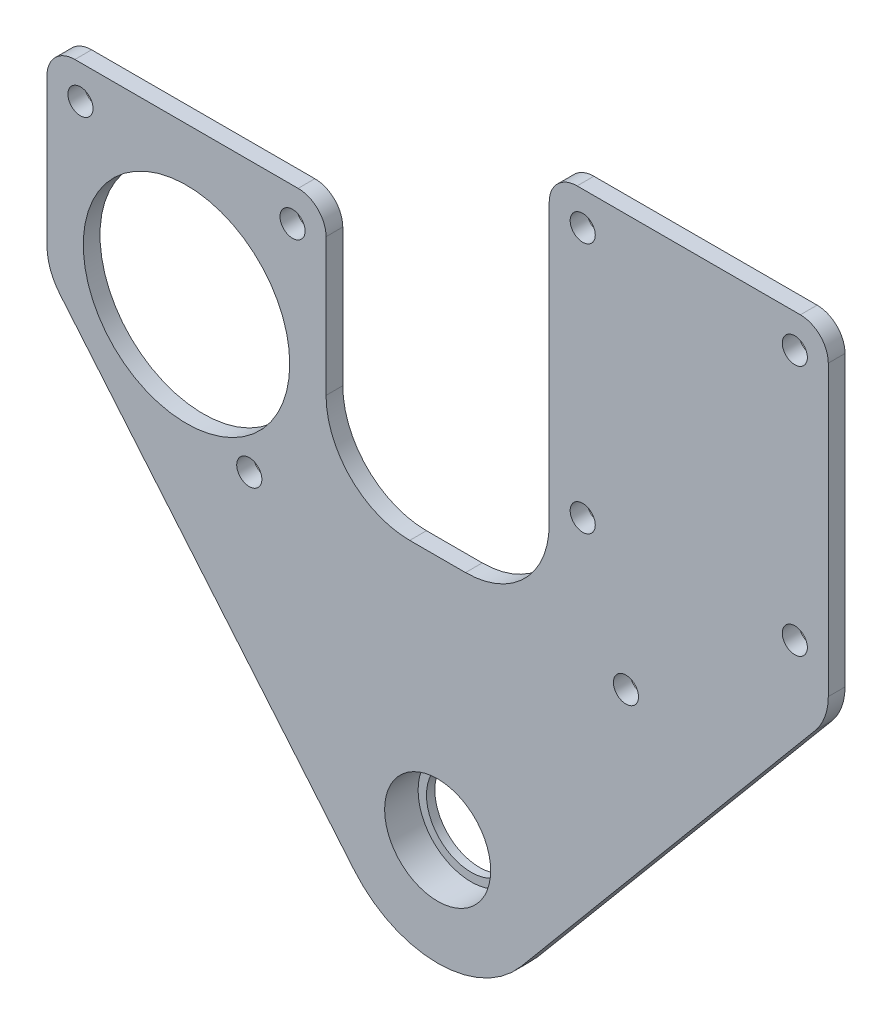
ISO-10303-21;
HEADER;
FILE_DESCRIPTION(('STEP AP214'),'2;1');
FILE_NAME('part.step','',(''),(''),'','','');
FILE_SCHEMA(('AUTOMOTIVE_DESIGN { 1 0 10303 214 1 1 1 1 }'));
ENDSEC;
DATA;
#1=APPLICATION_CONTEXT('core data for automotive mechanical design processes');
#2=APPLICATION_PROTOCOL_DEFINITION('international standard','automotive_design',2000,#1);
#3=PRODUCT_CONTEXT('',#1,'mechanical');
#4=PRODUCT('Part','Part','',(#3));
#5=PRODUCT_RELATED_PRODUCT_CATEGORY('part','',(#4));
#6=PRODUCT_DEFINITION_FORMATION('','',#4);
#7=PRODUCT_DEFINITION_CONTEXT('part definition',#1,'design');
#8=PRODUCT_DEFINITION('design','',#6,#7);
#9=PRODUCT_DEFINITION_SHAPE('','',#8);
#10=(LENGTH_UNIT() NAMED_UNIT(*) SI_UNIT(.MILLI.,.METRE.));
#11=(NAMED_UNIT(*) PLANE_ANGLE_UNIT() SI_UNIT($,.RADIAN.));
#12=(NAMED_UNIT(*) SI_UNIT($,.STERADIAN.) SOLID_ANGLE_UNIT());
#13=UNCERTAINTY_MEASURE_WITH_UNIT(LENGTH_MEASURE(1.E-05),#10,'distance_accuracy_value','');
#14=(GEOMETRIC_REPRESENTATION_CONTEXT(3) GLOBAL_UNCERTAINTY_ASSIGNED_CONTEXT((#13)) GLOBAL_UNIT_ASSIGNED_CONTEXT((#10,
#11,#12)) REPRESENTATION_CONTEXT('',''));
#15=CARTESIAN_POINT('',(0.,0.,0.));
#16=DIRECTION('',(0.,0.,1.));
#17=DIRECTION('',(1.,0.,0.));
#18=AXIS2_PLACEMENT_3D('',#15,#16,#17);
#19=CARTESIAN_POINT('',(0.,0.380634304939509,0.));
#20=DIRECTION('',(0.,0.,-1.));
#21=DIRECTION('',(-1.,0.,0.));
#22=AXIS2_PLACEMENT_3D('',#19,#20,#21);
#23=PLANE('',#22);
#24=CARTESIAN_POINT('',(0.,0.,0.));
#25=DIRECTION('',(0.,0.,-1.));
#26=DIRECTION('',(-1.,0.,0.));
#27=AXIS2_PLACEMENT_3D('',#24,#25,#26);
#28=CIRCLE('',#27,14.5);
#29=CARTESIAN_POINT('',(-14.5,0.,0.));
#30=VERTEX_POINT('',#29);
#31=EDGE_CURVE('E11',#30,#30,#28,.F.);
#32=ORIENTED_EDGE('',*,*,#31,.T.);
#33=EDGE_LOOP('',(#32));
#34=FACE_BOUND('',#33,.T.);
#35=CARTESIAN_POINT('',(63.995132678058,63.0000000000001,0.));
#36=DIRECTION('',(0.,0.,1.));
#37=DIRECTION('',(1.,0.,0.));
#38=AXIS2_PLACEMENT_3D('',#35,#36,#37);
#39=CIRCLE('',#38,2.25);
#40=CARTESIAN_POINT('',(66.245132678058,63.0000000000001,0.));
#41=VERTEX_POINT('',#40);
#42=EDGE_CURVE('E485',#41,#41,#39,.T.);
#43=ORIENTED_EDGE('',*,*,#42,.T.);
#44=EDGE_LOOP('',(#43));
#45=FACE_BOUND('',#44,.T.);
#46=CARTESIAN_POINT('',(63.995132678058,108.,0.));
#47=DIRECTION('',(0.,0.,1.));
#48=DIRECTION('',(1.,0.,0.));
#49=AXIS2_PLACEMENT_3D('',#46,#47,#48);
#50=CIRCLE('',#49,2.25000000000001);
#51=CARTESIAN_POINT('',(66.2451326780581,108.,0.));
#52=VERTEX_POINT('',#51);
#53=EDGE_CURVE('E473',#52,#52,#50,.T.);
#54=ORIENTED_EDGE('',*,*,#53,.T.);
#55=EDGE_LOOP('',(#54));
#56=FACE_BOUND('',#55,.T.);
#57=CARTESIAN_POINT('',(-25.9951326780577,82.6231110183285,0.));
#58=DIRECTION('',(0.,0.,1.));
#59=DIRECTION('',(1.,0.,0.));
#60=AXIS2_PLACEMENT_3D('',#57,#58,#59);
#61=CIRCLE('',#60,2.25);
#62=CARTESIAN_POINT('',(-23.7451326780577,82.6231110183285,0.));
#63=VERTEX_POINT('',#62);
#64=EDGE_CURVE('E461',#63,#63,#61,.T.);
#65=ORIENTED_EDGE('',*,*,#64,.T.);
#66=EDGE_LOOP('',(#65));
#67=FACE_BOUND('',#66,.T.);
#68=CARTESIAN_POINT('',(33.7463495085435,40.2173332637462,0.));
#69=DIRECTION('',(0.,0.,1.));
#70=DIRECTION('',(1.,0.,0.));
#71=AXIS2_PLACEMENT_3D('',#68,#69,#70);
#72=CIRCLE('',#71,2.25000000000002);
#73=CARTESIAN_POINT('',(35.9963495085435,40.2173332637462,0.));
#74=VERTEX_POINT('',#73);
#75=EDGE_CURVE('E449',#74,#74,#72,.T.);
#76=ORIENTED_EDGE('',*,*,#75,.T.);
#77=EDGE_LOOP('',(#76));
#78=FACE_BOUND('',#77,.T.);
#79=CARTESIAN_POINT('',(-44.9951326780577,60.6231110183285,0.));
#80=DIRECTION('',(0.,0.,1.));
#81=DIRECTION('',(1.,0.,0.));
#82=AXIS2_PLACEMENT_3D('',#79,#80,#81);
#83=CIRCLE('',#82,18.5);
#84=CARTESIAN_POINT('',(-26.4951326780577,60.6231110183285,0.));
#85=VERTEX_POINT('',#84);
#86=EDGE_CURVE('E437',#85,#85,#83,.T.);
#87=ORIENTED_EDGE('',*,*,#86,.T.);
#88=EDGE_LOOP('',(#87));
#89=FACE_BOUND('',#88,.T.);
#90=CARTESIAN_POINT('',(0.,0.380634304939509,0.));
#91=DIRECTION('',(0.,0.,1.));
#92=DIRECTION('',(-1.,0.,0.));
#93=AXIS2_PLACEMENT_3D('',#90,#91,#92);
#94=CIRCLE('',#93,19.5);
#95=CARTESIAN_POINT('',(-14.9530871698184,-12.1355625651889,0.));
#96=VERTEX_POINT('',#95);
#97=CARTESIAN_POINT('',(14.9530871698184,-12.135562565189,0.));
#98=VERTEX_POINT('',#97);
#99=EDGE_CURVE('E193',#96,#98,#94,.T.);
#100=ORIENTED_EDGE('',*,*,#99,.F.);
#101=DIRECTION('',(0.641856249750174,-0.766824983067611,0.));
#102=VECTOR('',#101,1.);
#103=CARTESIAN_POINT('',(-67.6633825087338,50.8373715559401,0.));
#104=LINE('',#103,#102);
#105=CARTESIAN_POINT('',(-67.6633825087338,50.8373715559401,0.));
#106=VERTEX_POINT('',#105);
#107=EDGE_CURVE('E116',#106,#96,#104,.T.);
#108=ORIENTED_EDGE('',*,*,#107,.F.);
#109=CARTESIAN_POINT('',(-59.9951326780577,57.2559340534418,0.));
#110=DIRECTION('',(0.,0.,1.));
#111=DIRECTION('',(1.,0.,0.));
#112=AXIS2_PLACEMENT_3D('',#109,#110,#111);
#113=CIRCLE('',#112,10.);
#114=CARTESIAN_POINT('',(-69.9951326780577,57.2559340534419,0.));
#115=VERTEX_POINT('',#114);
#116=EDGE_CURVE('E110',#115,#106,#113,.T.);
#117=ORIENTED_EDGE('',*,*,#116,.F.);
#118=DIRECTION('',(0.,-1.,0.));
#119=VECTOR('',#118,1.);
#120=CARTESIAN_POINT('',(-69.9951326780577,83.6231110183285,0.));
#121=LINE('',#120,#119);
#122=CARTESIAN_POINT('',(-69.9951326780577,83.6231110183285,0.));
#123=VERTEX_POINT('',#122);
#124=EDGE_CURVE('E183',#123,#115,#121,.T.);
#125=ORIENTED_EDGE('',*,*,#124,.F.);
#126=CARTESIAN_POINT('',(-64.9951326780577,83.6231110183285,0.));
#127=DIRECTION('',(0.,0.,1.));
#128=DIRECTION('',(-1.,0.,0.));
#129=AXIS2_PLACEMENT_3D('',#126,#127,#128);
#130=CIRCLE('',#129,5.);
#131=CARTESIAN_POINT('',(-64.9951326780577,88.6231110183285,0.));
#132=VERTEX_POINT('',#131);
#133=EDGE_CURVE('E223',#132,#123,#130,.T.);
#134=ORIENTED_EDGE('',*,*,#133,.F.);
#135=DIRECTION('',(-1.,0.,0.));
#136=VECTOR('',#135,1.);
#137=CARTESIAN_POINT('',(-24.9951326780577,88.6231110183285,0.));
#138=LINE('',#137,#136);
#139=CARTESIAN_POINT('',(-24.9951326780577,88.6231110183285,0.));
#140=VERTEX_POINT('',#139);
#141=EDGE_CURVE('E221',#140,#132,#138,.T.);
#142=ORIENTED_EDGE('',*,*,#141,.F.);
#143=CARTESIAN_POINT('',(-24.9951326780577,83.6231110183285,0.));
#144=DIRECTION('',(0.,0.,1.));
#145=DIRECTION('',(1.,0.,0.));
#146=AXIS2_PLACEMENT_3D('',#143,#144,#145);
#147=CIRCLE('',#146,5.);
#148=CARTESIAN_POINT('',(-19.9951326780577,83.6231110183285,0.));
#149=VERTEX_POINT('',#148);
#150=EDGE_CURVE('E219',#149,#140,#147,.T.);
#151=ORIENTED_EDGE('',*,*,#150,.F.);
#152=DIRECTION('',(0.,1.,0.));
#153=VECTOR('',#152,1.);
#154=CARTESIAN_POINT('',(-19.9951326780577,59.,0.));
#155=LINE('',#154,#153);
#156=CARTESIAN_POINT('',(-19.9951326780577,59.,0.));
#157=VERTEX_POINT('',#156);
#158=EDGE_CURVE('E217',#157,#149,#155,.T.);
#159=ORIENTED_EDGE('',*,*,#158,.F.);
#160=CARTESIAN_POINT('',(-4.99513267805768,59.,0.));
#161=DIRECTION('',(0.,0.,-1.));
#162=DIRECTION('',(-1.,0.,0.));
#163=AXIS2_PLACEMENT_3D('',#160,#161,#162);
#164=CIRCLE('',#163,15.);
#165=CARTESIAN_POINT('',(-4.99513267805768,44.,0.));
#166=VERTEX_POINT('',#165);
#167=EDGE_CURVE('E215',#166,#157,#164,.T.);
#168=ORIENTED_EDGE('',*,*,#167,.F.);
#169=DIRECTION('',(-1.,0.,0.));
#170=VECTOR('',#169,1.);
#171=CARTESIAN_POINT('',(4.99513267805803,44.,0.));
#172=LINE('',#171,#170);
#173=CARTESIAN_POINT('',(4.99513267805803,44.,0.));
#174=VERTEX_POINT('',#173);
#175=EDGE_CURVE('E213',#174,#166,#172,.T.);
#176=ORIENTED_EDGE('',*,*,#175,.F.);
#177=CARTESIAN_POINT('',(4.99513267805802,59.,0.));
#178=DIRECTION('',(0.,0.,-1.));
#179=DIRECTION('',(-1.,0.,0.));
#180=AXIS2_PLACEMENT_3D('',#177,#178,#179);
#181=CIRCLE('',#180,15.);
#182=CARTESIAN_POINT('',(19.995132678058,59.,0.));
#183=VERTEX_POINT('',#182);
#184=EDGE_CURVE('E211',#183,#174,#181,.T.);
#185=ORIENTED_EDGE('',*,*,#184,.F.);
#186=DIRECTION('',(0.,-1.,0.));
#187=VECTOR('',#186,1.);
#188=CARTESIAN_POINT('',(19.995132678058,109.,0.));
#189=LINE('',#188,#187);
#190=CARTESIAN_POINT('',(19.995132678058,109.,0.));
#191=VERTEX_POINT('',#190);
#192=EDGE_CURVE('E209',#191,#183,#189,.T.);
#193=ORIENTED_EDGE('',*,*,#192,.F.);
#194=CARTESIAN_POINT('',(24.995132678058,109.,0.));
#195=DIRECTION('',(0.,0.,1.));
#196=DIRECTION('',(1.,0.,0.));
#197=AXIS2_PLACEMENT_3D('',#194,#195,#196);
#198=CIRCLE('',#197,4.99999999999999);
#199=CARTESIAN_POINT('',(24.995132678058,114.,0.));
#200=VERTEX_POINT('',#199);
#201=EDGE_CURVE('E207',#200,#191,#198,.T.);
#202=ORIENTED_EDGE('',*,*,#201,.F.);
#203=DIRECTION('',(-1.,0.,0.));
#204=VECTOR('',#203,1.);
#205=CARTESIAN_POINT('',(64.995132678058,114.,0.));
#206=LINE('',#205,#204);
#207=CARTESIAN_POINT('',(64.995132678058,114.,0.));
#208=VERTEX_POINT('',#207);
#209=EDGE_CURVE('E205',#208,#200,#206,.T.);
#210=ORIENTED_EDGE('',*,*,#209,.F.);
#211=CARTESIAN_POINT('',(64.995132678058,109.,0.));
#212=DIRECTION('',(0.,0.,1.));
#213=DIRECTION('',(1.,0.,0.));
#214=AXIS2_PLACEMENT_3D('',#211,#212,#213);
#215=CIRCLE('',#214,5.);
#216=CARTESIAN_POINT('',(69.995132678058,109.,0.));
#217=VERTEX_POINT('',#216);
#218=EDGE_CURVE('E203',#217,#208,#215,.T.);
#219=ORIENTED_EDGE('',*,*,#218,.F.);
#220=DIRECTION('',(0.,1.,0.));
#221=VECTOR('',#220,1.);
#222=CARTESIAN_POINT('',(69.995132678058,57.2559340534416,0.));
#223=LINE('',#222,#221);
#224=CARTESIAN_POINT('',(69.995132678058,57.2559340534416,0.));
#225=VERTEX_POINT('',#224);
#226=EDGE_CURVE('E201',#225,#217,#223,.T.);
#227=ORIENTED_EDGE('',*,*,#226,.F.);
#228=CARTESIAN_POINT('',(59.995132678058,57.2559340534416,0.));
#229=DIRECTION('',(0.,0.,1.));
#230=DIRECTION('',(1.,0.,0.));
#231=AXIS2_PLACEMENT_3D('',#228,#229,#230);
#232=CIRCLE('',#231,10.);
#233=CARTESIAN_POINT('',(67.6633825087341,50.8373715559398,0.));
#234=VERTEX_POINT('',#233);
#235=EDGE_CURVE('E199',#234,#225,#232,.T.);
#236=ORIENTED_EDGE('',*,*,#235,.F.);
#237=DIRECTION('',(0.641856249750177,0.766824983067609,0.));
#238=VECTOR('',#237,1.);
#239=CARTESIAN_POINT('',(14.9530871698184,-12.135562565189,0.));
#240=LINE('',#239,#238);
#241=EDGE_CURVE('E196',#98,#234,#240,.T.);
#242=ORIENTED_EDGE('',*,*,#241,.F.);
#243=EDGE_LOOP('',(#100,#108,#117,#125,#134,#142,#151,#159,#168,#176,#185,#193,#202,#210,#219,
#227,#236,#242));
#244=FACE_BOUND('',#243,.T.);
#245=CARTESIAN_POINT('',(-33.7463495085433,40.2173332637464,0.));
#246=DIRECTION('',(0.,0.,1.));
#247=DIRECTION('',(1.,0.,0.));
#248=AXIS2_PLACEMENT_3D('',#245,#246,#247);
#249=CIRCLE('',#248,2.25);
#250=CARTESIAN_POINT('',(-31.4963495085433,40.2173332637464,0.));
#251=VERTEX_POINT('',#250);
#252=EDGE_CURVE('E443',#251,#251,#249,.T.);
#253=ORIENTED_EDGE('',*,*,#252,.T.);
#254=EDGE_LOOP('',(#253));
#255=FACE_BOUND('',#254,.T.);
#256=CARTESIAN_POINT('',(-63.9951326780577,82.6231110183285,0.));
#257=DIRECTION('',(0.,0.,1.));
#258=DIRECTION('',(1.,0.,0.));
#259=AXIS2_PLACEMENT_3D('',#256,#257,#258);
#260=CIRCLE('',#259,2.25);
#261=CARTESIAN_POINT('',(-61.7451326780577,82.6231110183285,0.));
#262=VERTEX_POINT('',#261);
#263=EDGE_CURVE('E455',#262,#262,#260,.T.);
#264=ORIENTED_EDGE('',*,*,#263,.T.);
#265=EDGE_LOOP('',(#264));
#266=FACE_BOUND('',#265,.T.);
#267=CARTESIAN_POINT('',(25.995132678058,108.,0.));
#268=DIRECTION('',(0.,0.,1.));
#269=DIRECTION('',(1.,0.,0.));
#270=AXIS2_PLACEMENT_3D('',#267,#268,#269);
#271=CIRCLE('',#270,2.25);
#272=CARTESIAN_POINT('',(28.245132678058,108.,0.));
#273=VERTEX_POINT('',#272);
#274=EDGE_CURVE('E467',#273,#273,#271,.T.);
#275=ORIENTED_EDGE('',*,*,#274,.T.);
#276=EDGE_LOOP('',(#275));
#277=FACE_BOUND('',#276,.T.);
#278=CARTESIAN_POINT('',(25.995132678058,63.,0.));
#279=DIRECTION('',(0.,0.,1.));
#280=DIRECTION('',(1.,0.,0.));
#281=AXIS2_PLACEMENT_3D('',#278,#279,#280);
#282=CIRCLE('',#281,2.25);
#283=CARTESIAN_POINT('',(28.245132678058,63.,0.));
#284=VERTEX_POINT('',#283);
#285=EDGE_CURVE('E479',#284,#284,#282,.T.);
#286=ORIENTED_EDGE('',*,*,#285,.T.);
#287=EDGE_LOOP('',(#286));
#288=FACE_BOUND('',#287,.T.);
#289=ADVANCED_FACE('F34',(#34,#45,#56,#67,#78,#89,#244,#255,#266,#277,#288),#23,.T.);
#290=CARTESIAN_POINT('',(0.,0.380634304939509,3.));
#291=DIRECTION('',(0.,0.,-1.));
#292=DIRECTION('',(-1.,0.,0.));
#293=AXIS2_PLACEMENT_3D('',#290,#291,#292);
#294=PLANE('',#293);
#295=CARTESIAN_POINT('',(0.,0.380634304939509,3.));
#296=DIRECTION('',(0.,0.,1.));
#297=DIRECTION('',(-1.,0.,0.));
#298=AXIS2_PLACEMENT_3D('',#295,#296,#297);
#299=CIRCLE('',#298,19.5);
#300=CARTESIAN_POINT('',(-14.9530871698184,-12.1355625651889,3.));
#301=VERTEX_POINT('',#300);
#302=CARTESIAN_POINT('',(14.9530871698184,-12.135562565189,3.));
#303=VERTEX_POINT('',#302);
#304=EDGE_CURVE('E228',#301,#303,#299,.T.);
#305=ORIENTED_EDGE('',*,*,#304,.T.);
#306=DIRECTION('',(0.641856249750177,0.766824983067609,0.));
#307=VECTOR('',#306,1.);
#308=CARTESIAN_POINT('',(14.9530871698184,-12.135562565189,3.));
#309=LINE('',#308,#307);
#310=CARTESIAN_POINT('',(67.6633825087341,50.8373715559398,3.));
#311=VERTEX_POINT('',#310);
#312=EDGE_CURVE('E125',#303,#311,#309,.T.);
#313=ORIENTED_EDGE('',*,*,#312,.T.);
#314=CARTESIAN_POINT('',(59.995132678058,57.2559340534416,3.));
#315=DIRECTION('',(0.,0.,1.));
#316=DIRECTION('',(1.,0.,0.));
#317=AXIS2_PLACEMENT_3D('',#314,#315,#316);
#318=CIRCLE('',#317,10.);
#319=CARTESIAN_POINT('',(69.995132678058,57.2559340534416,3.));
#320=VERTEX_POINT('',#319);
#321=EDGE_CURVE('E374',#311,#320,#318,.T.);
#322=ORIENTED_EDGE('',*,*,#321,.T.);
#323=DIRECTION('',(0.,1.,0.));
#324=VECTOR('',#323,1.);
#325=CARTESIAN_POINT('',(69.995132678058,57.2559340534416,3.));
#326=LINE('',#325,#324);
#327=CARTESIAN_POINT('',(69.995132678058,109.,3.));
#328=VERTEX_POINT('',#327);
#329=EDGE_CURVE('E376',#320,#328,#326,.T.);
#330=ORIENTED_EDGE('',*,*,#329,.T.);
#331=CARTESIAN_POINT('',(64.995132678058,109.,3.));
#332=DIRECTION('',(0.,0.,1.));
#333=DIRECTION('',(1.,0.,0.));
#334=AXIS2_PLACEMENT_3D('',#331,#332,#333);
#335=CIRCLE('',#334,5.);
#336=CARTESIAN_POINT('',(64.995132678058,114.,3.));
#337=VERTEX_POINT('',#336);
#338=EDGE_CURVE('E378',#328,#337,#335,.T.);
#339=ORIENTED_EDGE('',*,*,#338,.T.);
#340=DIRECTION('',(-1.,0.,0.));
#341=VECTOR('',#340,1.);
#342=CARTESIAN_POINT('',(64.995132678058,114.,3.));
#343=LINE('',#342,#341);
#344=CARTESIAN_POINT('',(24.995132678058,114.,3.));
#345=VERTEX_POINT('',#344);
#346=EDGE_CURVE('E384',#337,#345,#343,.T.);
#347=ORIENTED_EDGE('',*,*,#346,.T.);
#348=CARTESIAN_POINT('',(24.995132678058,109.,3.));
#349=DIRECTION('',(0.,0.,1.));
#350=DIRECTION('',(1.,0.,0.));
#351=AXIS2_PLACEMENT_3D('',#348,#349,#350);
#352=CIRCLE('',#351,4.99999999999999);
#353=CARTESIAN_POINT('',(19.995132678058,109.,3.));
#354=VERTEX_POINT('',#353);
#355=EDGE_CURVE('E386',#345,#354,#352,.T.);
#356=ORIENTED_EDGE('',*,*,#355,.T.);
#357=DIRECTION('',(0.,-1.,0.));
#358=VECTOR('',#357,1.);
#359=CARTESIAN_POINT('',(19.995132678058,109.,3.));
#360=LINE('',#359,#358);
#361=CARTESIAN_POINT('',(19.995132678058,59.,3.));
#362=VERTEX_POINT('',#361);
#363=EDGE_CURVE('E388',#354,#362,#360,.T.);
#364=ORIENTED_EDGE('',*,*,#363,.T.);
#365=CARTESIAN_POINT('',(4.99513267805802,59.,3.));
#366=DIRECTION('',(0.,0.,-1.));
#367=DIRECTION('',(-1.,0.,0.));
#368=AXIS2_PLACEMENT_3D('',#365,#366,#367);
#369=CIRCLE('',#368,15.);
#370=CARTESIAN_POINT('',(4.99513267805803,44.,3.));
#371=VERTEX_POINT('',#370);
#372=EDGE_CURVE('E390',#362,#371,#369,.T.);
#373=ORIENTED_EDGE('',*,*,#372,.T.);
#374=DIRECTION('',(-1.,0.,0.));
#375=VECTOR('',#374,1.);
#376=CARTESIAN_POINT('',(4.99513267805803,44.,3.));
#377=LINE('',#376,#375);
#378=CARTESIAN_POINT('',(-4.99513267805768,44.,3.));
#379=VERTEX_POINT('',#378);
#380=EDGE_CURVE('E392',#371,#379,#377,.T.);
#381=ORIENTED_EDGE('',*,*,#380,.T.);
#382=CARTESIAN_POINT('',(-4.99513267805768,59.,3.));
#383=DIRECTION('',(0.,0.,-1.));
#384=DIRECTION('',(-1.,0.,0.));
#385=AXIS2_PLACEMENT_3D('',#382,#383,#384);
#386=CIRCLE('',#385,15.);
#387=CARTESIAN_POINT('',(-19.9951326780577,59.,3.));
#388=VERTEX_POINT('',#387);
#389=EDGE_CURVE('E394',#379,#388,#386,.T.);
#390=ORIENTED_EDGE('',*,*,#389,.T.);
#391=DIRECTION('',(0.,1.,0.));
#392=VECTOR('',#391,1.);
#393=CARTESIAN_POINT('',(-19.9951326780577,59.,3.));
#394=LINE('',#393,#392);
#395=CARTESIAN_POINT('',(-19.9951326780577,83.6231110183285,3.));
#396=VERTEX_POINT('',#395);
#397=EDGE_CURVE('E396',#388,#396,#394,.T.);
#398=ORIENTED_EDGE('',*,*,#397,.T.);
#399=CARTESIAN_POINT('',(-24.9951326780577,83.6231110183285,3.));
#400=DIRECTION('',(0.,0.,1.));
#401=DIRECTION('',(1.,0.,0.));
#402=AXIS2_PLACEMENT_3D('',#399,#400,#401);
#403=CIRCLE('',#402,5.);
#404=CARTESIAN_POINT('',(-24.9951326780577,88.6231110183285,3.));
#405=VERTEX_POINT('',#404);
#406=EDGE_CURVE('E398',#396,#405,#403,.T.);
#407=ORIENTED_EDGE('',*,*,#406,.T.);
#408=DIRECTION('',(-1.,0.,0.));
#409=VECTOR('',#408,1.);
#410=CARTESIAN_POINT('',(-24.9951326780577,88.6231110183285,3.));
#411=LINE('',#410,#409);
#412=CARTESIAN_POINT('',(-64.9951326780577,88.6231110183285,3.));
#413=VERTEX_POINT('',#412);
#414=EDGE_CURVE('E400',#405,#413,#411,.T.);
#415=ORIENTED_EDGE('',*,*,#414,.T.);
#416=CARTESIAN_POINT('',(-64.9951326780577,83.6231110183285,3.));
#417=DIRECTION('',(0.,0.,1.));
#418=DIRECTION('',(-1.,0.,0.));
#419=AXIS2_PLACEMENT_3D('',#416,#417,#418);
#420=CIRCLE('',#419,5.);
#421=CARTESIAN_POINT('',(-69.9951326780577,83.6231110183285,3.));
#422=VERTEX_POINT('',#421);
#423=EDGE_CURVE('E175',#413,#422,#420,.T.);
#424=ORIENTED_EDGE('',*,*,#423,.T.);
#425=DIRECTION('',(0.,-1.,0.));
#426=VECTOR('',#425,1.);
#427=CARTESIAN_POINT('',(-69.9951326780577,83.6231110183285,3.));
#428=LINE('',#427,#426);
#429=CARTESIAN_POINT('',(-69.9951326780577,57.2559340534419,3.));
#430=VERTEX_POINT('',#429);
#431=EDGE_CURVE('E168',#422,#430,#428,.T.);
#432=ORIENTED_EDGE('',*,*,#431,.T.);
#433=CARTESIAN_POINT('',(-59.9951326780577,57.2559340534418,3.));
#434=DIRECTION('',(0.,0.,1.));
#435=DIRECTION('',(1.,0.,0.));
#436=AXIS2_PLACEMENT_3D('',#433,#434,#435);
#437=CIRCLE('',#436,10.);
#438=CARTESIAN_POINT('',(-67.6633825087338,50.8373715559401,3.));
#439=VERTEX_POINT('',#438);
#440=EDGE_CURVE('E173',#430,#439,#437,.T.);
#441=ORIENTED_EDGE('',*,*,#440,.T.);
#442=DIRECTION('',(0.641856249750174,-0.766824983067611,0.));
#443=VECTOR('',#442,1.);
#444=CARTESIAN_POINT('',(-67.6633825087338,50.8373715559401,3.));
#445=LINE('',#444,#443);
#446=EDGE_CURVE('E51',#439,#301,#445,.T.);
#447=ORIENTED_EDGE('',*,*,#446,.T.);
#448=EDGE_LOOP('',(#305,#313,#322,#330,#339,#347,#356,#364,#373,#381,#390,#398,#407,#415,#424,
#432,#441,#447));
#449=FACE_BOUND('',#448,.T.);
#450=CARTESIAN_POINT('',(0.,0.,3.));
#451=DIRECTION('',(0.,0.,1.));
#452=DIRECTION('',(1.,0.,0.));
#453=AXIS2_PLACEMENT_3D('',#450,#451,#452);
#454=CIRCLE('',#453,9.5);
#455=CARTESIAN_POINT('',(9.5,0.,3.));
#456=VERTEX_POINT('',#455);
#457=EDGE_CURVE('E197',#456,#456,#454,.T.);
#458=ORIENTED_EDGE('',*,*,#457,.F.);
#459=EDGE_LOOP('',(#458));
#460=FACE_BOUND('',#459,.T.);
#461=CARTESIAN_POINT('',(-44.9951326780577,60.6231110183285,3.));
#462=DIRECTION('',(0.,0.,1.));
#463=DIRECTION('',(1.,0.,0.));
#464=AXIS2_PLACEMENT_3D('',#461,#462,#463);
#465=CIRCLE('',#464,18.5);
#466=CARTESIAN_POINT('',(-26.4951326780577,60.6231110183285,3.));
#467=VERTEX_POINT('',#466);
#468=EDGE_CURVE('E436',#467,#467,#465,.T.);
#469=ORIENTED_EDGE('',*,*,#468,.F.);
#470=EDGE_LOOP('',(#469));
#471=FACE_BOUND('',#470,.T.);
#472=CARTESIAN_POINT('',(-33.7463495085433,40.2173332637464,3.));
#473=DIRECTION('',(0.,0.,1.));
#474=DIRECTION('',(1.,0.,0.));
#475=AXIS2_PLACEMENT_3D('',#472,#473,#474);
#476=CIRCLE('',#475,2.25);
#477=CARTESIAN_POINT('',(-31.4963495085433,40.2173332637464,3.));
#478=VERTEX_POINT('',#477);
#479=EDGE_CURVE('E440',#478,#478,#476,.T.);
#480=ORIENTED_EDGE('',*,*,#479,.F.);
#481=EDGE_LOOP('',(#480));
#482=FACE_BOUND('',#481,.T.);
#483=CARTESIAN_POINT('',(33.7463495085435,40.2173332637462,3.));
#484=DIRECTION('',(0.,0.,1.));
#485=DIRECTION('',(1.,0.,0.));
#486=AXIS2_PLACEMENT_3D('',#483,#484,#485);
#487=CIRCLE('',#486,2.25000000000002);
#488=CARTESIAN_POINT('',(35.9963495085435,40.2173332637462,3.));
#489=VERTEX_POINT('',#488);
#490=EDGE_CURVE('E446',#489,#489,#487,.T.);
#491=ORIENTED_EDGE('',*,*,#490,.F.);
#492=EDGE_LOOP('',(#491));
#493=FACE_BOUND('',#492,.T.);
#494=CARTESIAN_POINT('',(-63.9951326780577,82.6231110183285,3.));
#495=DIRECTION('',(0.,0.,1.));
#496=DIRECTION('',(1.,0.,0.));
#497=AXIS2_PLACEMENT_3D('',#494,#495,#496);
#498=CIRCLE('',#497,2.25);
#499=CARTESIAN_POINT('',(-61.7451326780577,82.6231110183285,3.));
#500=VERTEX_POINT('',#499);
#501=EDGE_CURVE('E452',#500,#500,#498,.T.);
#502=ORIENTED_EDGE('',*,*,#501,.F.);
#503=EDGE_LOOP('',(#502));
#504=FACE_BOUND('',#503,.T.);
#505=CARTESIAN_POINT('',(-25.9951326780577,82.6231110183285,3.));
#506=DIRECTION('',(0.,0.,1.));
#507=DIRECTION('',(1.,0.,0.));
#508=AXIS2_PLACEMENT_3D('',#505,#506,#507);
#509=CIRCLE('',#508,2.25);
#510=CARTESIAN_POINT('',(-23.7451326780577,82.6231110183285,3.));
#511=VERTEX_POINT('',#510);
#512=EDGE_CURVE('E458',#511,#511,#509,.T.);
#513=ORIENTED_EDGE('',*,*,#512,.F.);
#514=EDGE_LOOP('',(#513));
#515=FACE_BOUND('',#514,.T.);
#516=CARTESIAN_POINT('',(25.995132678058,108.,3.));
#517=DIRECTION('',(0.,0.,1.));
#518=DIRECTION('',(1.,0.,0.));
#519=AXIS2_PLACEMENT_3D('',#516,#517,#518);
#520=CIRCLE('',#519,2.25);
#521=CARTESIAN_POINT('',(28.245132678058,108.,3.));
#522=VERTEX_POINT('',#521);
#523=EDGE_CURVE('E464',#522,#522,#520,.T.);
#524=ORIENTED_EDGE('',*,*,#523,.F.);
#525=EDGE_LOOP('',(#524));
#526=FACE_BOUND('',#525,.T.);
#527=CARTESIAN_POINT('',(63.995132678058,108.,3.));
#528=DIRECTION('',(0.,0.,1.));
#529=DIRECTION('',(1.,0.,0.));
#530=AXIS2_PLACEMENT_3D('',#527,#528,#529);
#531=CIRCLE('',#530,2.25000000000001);
#532=CARTESIAN_POINT('',(66.2451326780581,108.,3.));
#533=VERTEX_POINT('',#532);
#534=EDGE_CURVE('E470',#533,#533,#531,.T.);
#535=ORIENTED_EDGE('',*,*,#534,.F.);
#536=EDGE_LOOP('',(#535));
#537=FACE_BOUND('',#536,.T.);
#538=CARTESIAN_POINT('',(25.995132678058,63.,3.));
#539=DIRECTION('',(0.,0.,1.));
#540=DIRECTION('',(1.,0.,0.));
#541=AXIS2_PLACEMENT_3D('',#538,#539,#540);
#542=CIRCLE('',#541,2.25);
#543=CARTESIAN_POINT('',(28.245132678058,63.,3.));
#544=VERTEX_POINT('',#543);
#545=EDGE_CURVE('E476',#544,#544,#542,.T.);
#546=ORIENTED_EDGE('',*,*,#545,.F.);
#547=EDGE_LOOP('',(#546));
#548=FACE_BOUND('',#547,.T.);
#549=CARTESIAN_POINT('',(63.995132678058,63.0000000000001,3.));
#550=DIRECTION('',(0.,0.,1.));
#551=DIRECTION('',(1.,0.,0.));
#552=AXIS2_PLACEMENT_3D('',#549,#550,#551);
#553=CIRCLE('',#552,2.25);
#554=CARTESIAN_POINT('',(66.245132678058,63.0000000000001,3.));
#555=VERTEX_POINT('',#554);
#556=EDGE_CURVE('E482',#555,#555,#553,.T.);
#557=ORIENTED_EDGE('',*,*,#556,.F.);
#558=EDGE_LOOP('',(#557));
#559=FACE_BOUND('',#558,.T.);
#560=ADVANCED_FACE('F170',(#449,#460,#471,#482,#493,#504,#515,#526,#537,#548,#559),#294,.F.);
#561=CARTESIAN_POINT('',(0.,0.380634304939509,3.));
#562=DIRECTION('',(0.,0.,-1.));
#563=DIRECTION('',(-1.,0.,0.));
#564=AXIS2_PLACEMENT_3D('',#561,#562,#563);
#565=CYLINDRICAL_SURFACE('',#564,19.5);
#566=ORIENTED_EDGE('',*,*,#99,.T.);
#567=DIRECTION('',(0.,0.,-1.));
#568=VECTOR('',#567,1.);
#569=CARTESIAN_POINT('',(14.9530871698184,-12.135562565189,3.));
#570=LINE('',#569,#568);
#571=EDGE_CURVE('E271',#303,#98,#570,.T.);
#572=ORIENTED_EDGE('',*,*,#571,.F.);
#573=ORIENTED_EDGE('',*,*,#304,.F.);
#574=DIRECTION('',(0.,0.,-1.));
#575=VECTOR('',#574,1.);
#576=CARTESIAN_POINT('',(-14.9530871698184,-12.1355625651889,3.));
#577=LINE('',#576,#575);
#578=EDGE_CURVE('E189',#301,#96,#577,.T.);
#579=ORIENTED_EDGE('',*,*,#578,.T.);
#580=EDGE_LOOP('',(#566,#572,#573,#579));
#581=FACE_BOUND('',#580,.T.);
#582=ADVANCED_FACE('F294',(#581),#565,.T.);
#583=CARTESIAN_POINT('',(14.9530871698184,-12.135562565189,3.));
#584=DIRECTION('',(-0.766824983067608,0.641856249750177,0.));
#585=DIRECTION('',(-0.641856249750177,-0.766824983067609,0.));
#586=AXIS2_PLACEMENT_3D('',#583,#584,#585);
#587=PLANE('',#586);
#588=ORIENTED_EDGE('',*,*,#241,.T.);
#589=DIRECTION('',(0.,0.,-1.));
#590=VECTOR('',#589,1.);
#591=CARTESIAN_POINT('',(67.6633825087341,50.8373715559398,3.));
#592=LINE('',#591,#590);
#593=EDGE_CURVE('E268',#311,#234,#592,.T.);
#594=ORIENTED_EDGE('',*,*,#593,.F.);
#595=ORIENTED_EDGE('',*,*,#312,.F.);
#596=ORIENTED_EDGE('',*,*,#571,.T.);
#597=EDGE_LOOP('',(#588,#594,#595,#596));
#598=FACE_BOUND('',#597,.T.);
#599=ADVANCED_FACE('F358',(#598),#587,.F.);
#600=CARTESIAN_POINT('',(59.995132678058,57.2559340534416,3.));
#601=DIRECTION('',(0.,0.,-1.));
#602=DIRECTION('',(-1.,0.,0.));
#603=AXIS2_PLACEMENT_3D('',#600,#601,#602);
#604=CYLINDRICAL_SURFACE('',#603,10.);
#605=ORIENTED_EDGE('',*,*,#235,.T.);
#606=DIRECTION('',(0.,0.,-1.));
#607=VECTOR('',#606,1.);
#608=CARTESIAN_POINT('',(69.995132678058,57.2559340534416,3.));
#609=LINE('',#608,#607);
#610=EDGE_CURVE('E265',#320,#225,#609,.T.);
#611=ORIENTED_EDGE('',*,*,#610,.F.);
#612=ORIENTED_EDGE('',*,*,#321,.F.);
#613=ORIENTED_EDGE('',*,*,#593,.T.);
#614=EDGE_LOOP('',(#605,#611,#612,#613));
#615=FACE_BOUND('',#614,.T.);
#616=ADVANCED_FACE('F354',(#615),#604,.T.);
#617=CARTESIAN_POINT('',(69.995132678058,57.2559340534416,3.));
#618=DIRECTION('',(-1.,0.,0.));
#619=DIRECTION('',(0.,0.,1.));
#620=AXIS2_PLACEMENT_3D('',#617,#618,#619);
#621=PLANE('',#620);
#622=ORIENTED_EDGE('',*,*,#226,.T.);
#623=DIRECTION('',(0.,0.,-1.));
#624=VECTOR('',#623,1.);
#625=CARTESIAN_POINT('',(69.995132678058,109.,3.));
#626=LINE('',#625,#624);
#627=EDGE_CURVE('E262',#328,#217,#626,.T.);
#628=ORIENTED_EDGE('',*,*,#627,.F.);
#629=ORIENTED_EDGE('',*,*,#329,.F.);
#630=ORIENTED_EDGE('',*,*,#610,.T.);
#631=EDGE_LOOP('',(#622,#628,#629,#630));
#632=FACE_BOUND('',#631,.T.);
#633=ADVANCED_FACE('F350',(#632),#621,.F.);
#634=CARTESIAN_POINT('',(64.995132678058,109.,3.));
#635=DIRECTION('',(0.,0.,-1.));
#636=DIRECTION('',(-1.,0.,0.));
#637=AXIS2_PLACEMENT_3D('',#634,#635,#636);
#638=CYLINDRICAL_SURFACE('',#637,5.);
#639=ORIENTED_EDGE('',*,*,#218,.T.);
#640=DIRECTION('',(0.,0.,-1.));
#641=VECTOR('',#640,1.);
#642=CARTESIAN_POINT('',(64.995132678058,114.,3.));
#643=LINE('',#642,#641);
#644=EDGE_CURVE('E259',#337,#208,#643,.T.);
#645=ORIENTED_EDGE('',*,*,#644,.F.);
#646=ORIENTED_EDGE('',*,*,#338,.F.);
#647=ORIENTED_EDGE('',*,*,#627,.T.);
#648=EDGE_LOOP('',(#639,#645,#646,#647));
#649=FACE_BOUND('',#648,.T.);
#650=ADVANCED_FACE('F346',(#649),#638,.T.);
#651=CARTESIAN_POINT('',(64.995132678058,114.,3.));
#652=DIRECTION('',(0.,-1.,0.));
#653=DIRECTION('',(0.,0.,-1.));
#654=AXIS2_PLACEMENT_3D('',#651,#652,#653);
#655=PLANE('',#654);
#656=ORIENTED_EDGE('',*,*,#209,.T.);
#657=DIRECTION('',(0.,0.,-1.));
#658=VECTOR('',#657,1.);
#659=CARTESIAN_POINT('',(24.995132678058,114.,3.));
#660=LINE('',#659,#658);
#661=EDGE_CURVE('E256',#345,#200,#660,.T.);
#662=ORIENTED_EDGE('',*,*,#661,.F.);
#663=ORIENTED_EDGE('',*,*,#346,.F.);
#664=ORIENTED_EDGE('',*,*,#644,.T.);
#665=EDGE_LOOP('',(#656,#662,#663,#664));
#666=FACE_BOUND('',#665,.T.);
#667=ADVANCED_FACE('F342',(#666),#655,.F.);
#668=CARTESIAN_POINT('',(24.995132678058,109.,3.));
#669=DIRECTION('',(0.,0.,-1.));
#670=DIRECTION('',(-1.,0.,0.));
#671=AXIS2_PLACEMENT_3D('',#668,#669,#670);
#672=CYLINDRICAL_SURFACE('',#671,4.99999999999999);
#673=ORIENTED_EDGE('',*,*,#201,.T.);
#674=DIRECTION('',(0.,0.,-1.));
#675=VECTOR('',#674,1.);
#676=CARTESIAN_POINT('',(19.995132678058,109.,3.));
#677=LINE('',#676,#675);
#678=EDGE_CURVE('E253',#354,#191,#677,.T.);
#679=ORIENTED_EDGE('',*,*,#678,.F.);
#680=ORIENTED_EDGE('',*,*,#355,.F.);
#681=ORIENTED_EDGE('',*,*,#661,.T.);
#682=EDGE_LOOP('',(#673,#679,#680,#681));
#683=FACE_BOUND('',#682,.T.);
#684=ADVANCED_FACE('F338',(#683),#672,.T.);
#685=CARTESIAN_POINT('',(19.995132678058,109.,3.));
#686=DIRECTION('',(1.,0.,0.));
#687=DIRECTION('',(0.,1.,0.));
#688=AXIS2_PLACEMENT_3D('',#685,#686,#687);
#689=PLANE('',#688);
#690=ORIENTED_EDGE('',*,*,#192,.T.);
#691=DIRECTION('',(0.,0.,-1.));
#692=VECTOR('',#691,1.);
#693=CARTESIAN_POINT('',(19.995132678058,59.,3.));
#694=LINE('',#693,#692);
#695=EDGE_CURVE('E250',#362,#183,#694,.T.);
#696=ORIENTED_EDGE('',*,*,#695,.F.);
#697=ORIENTED_EDGE('',*,*,#363,.F.);
#698=ORIENTED_EDGE('',*,*,#678,.T.);
#699=EDGE_LOOP('',(#690,#696,#697,#698));
#700=FACE_BOUND('',#699,.T.);
#701=ADVANCED_FACE('F334',(#700),#689,.F.);
#702=CARTESIAN_POINT('',(4.99513267805802,59.,3.));
#703=DIRECTION('',(0.,0.,-1.));
#704=DIRECTION('',(-1.,0.,0.));
#705=AXIS2_PLACEMENT_3D('',#702,#703,#704);
#706=CYLINDRICAL_SURFACE('',#705,15.);
#707=ORIENTED_EDGE('',*,*,#184,.T.);
#708=DIRECTION('',(0.,0.,-1.));
#709=VECTOR('',#708,1.);
#710=CARTESIAN_POINT('',(4.99513267805803,44.,3.));
#711=LINE('',#710,#709);
#712=EDGE_CURVE('E247',#371,#174,#711,.T.);
#713=ORIENTED_EDGE('',*,*,#712,.F.);
#714=ORIENTED_EDGE('',*,*,#372,.F.);
#715=ORIENTED_EDGE('',*,*,#695,.T.);
#716=EDGE_LOOP('',(#707,#713,#714,#715));
#717=FACE_BOUND('',#716,.T.);
#718=ADVANCED_FACE('F330',(#717),#706,.F.);
#719=CARTESIAN_POINT('',(4.99513267805803,44.,3.));
#720=DIRECTION('',(0.,-1.,0.));
#721=DIRECTION('',(0.,0.,-1.));
#722=AXIS2_PLACEMENT_3D('',#719,#720,#721);
#723=PLANE('',#722);
#724=ORIENTED_EDGE('',*,*,#175,.T.);
#725=DIRECTION('',(0.,0.,-1.));
#726=VECTOR('',#725,1.);
#727=CARTESIAN_POINT('',(-4.99513267805768,44.,3.));
#728=LINE('',#727,#726);
#729=EDGE_CURVE('E244',#379,#166,#728,.T.);
#730=ORIENTED_EDGE('',*,*,#729,.F.);
#731=ORIENTED_EDGE('',*,*,#380,.F.);
#732=ORIENTED_EDGE('',*,*,#712,.T.);
#733=EDGE_LOOP('',(#724,#730,#731,#732));
#734=FACE_BOUND('',#733,.T.);
#735=ADVANCED_FACE('F326',(#734),#723,.F.);
#736=CARTESIAN_POINT('',(-4.99513267805768,59.,3.));
#737=DIRECTION('',(0.,0.,-1.));
#738=DIRECTION('',(-1.,0.,0.));
#739=AXIS2_PLACEMENT_3D('',#736,#737,#738);
#740=CYLINDRICAL_SURFACE('',#739,15.);
#741=ORIENTED_EDGE('',*,*,#167,.T.);
#742=DIRECTION('',(0.,0.,-1.));
#743=VECTOR('',#742,1.);
#744=CARTESIAN_POINT('',(-19.9951326780577,59.,3.));
#745=LINE('',#744,#743);
#746=EDGE_CURVE('E241',#388,#157,#745,.T.);
#747=ORIENTED_EDGE('',*,*,#746,.F.);
#748=ORIENTED_EDGE('',*,*,#389,.F.);
#749=ORIENTED_EDGE('',*,*,#729,.T.);
#750=EDGE_LOOP('',(#741,#747,#748,#749));
#751=FACE_BOUND('',#750,.T.);
#752=ADVANCED_FACE('F322',(#751),#740,.F.);
#753=CARTESIAN_POINT('',(-19.9951326780577,59.,3.));
#754=DIRECTION('',(-1.,0.,0.));
#755=DIRECTION('',(0.,-1.,0.));
#756=AXIS2_PLACEMENT_3D('',#753,#754,#755);
#757=PLANE('',#756);
#758=ORIENTED_EDGE('',*,*,#158,.T.);
#759=DIRECTION('',(0.,0.,-1.));
#760=VECTOR('',#759,1.);
#761=CARTESIAN_POINT('',(-19.9951326780577,83.6231110183285,3.));
#762=LINE('',#761,#760);
#763=EDGE_CURVE('E238',#396,#149,#762,.T.);
#764=ORIENTED_EDGE('',*,*,#763,.F.);
#765=ORIENTED_EDGE('',*,*,#397,.F.);
#766=ORIENTED_EDGE('',*,*,#746,.T.);
#767=EDGE_LOOP('',(#758,#764,#765,#766));
#768=FACE_BOUND('',#767,.T.);
#769=ADVANCED_FACE('F318',(#768),#757,.F.);
#770=CARTESIAN_POINT('',(-24.9951326780577,83.6231110183285,3.));
#771=DIRECTION('',(0.,0.,-1.));
#772=DIRECTION('',(-1.,0.,0.));
#773=AXIS2_PLACEMENT_3D('',#770,#771,#772);
#774=CYLINDRICAL_SURFACE('',#773,5.);
#775=ORIENTED_EDGE('',*,*,#150,.T.);
#776=DIRECTION('',(0.,0.,-1.));
#777=VECTOR('',#776,1.);
#778=CARTESIAN_POINT('',(-24.9951326780577,88.6231110183285,3.));
#779=LINE('',#778,#777);
#780=EDGE_CURVE('E235',#405,#140,#779,.T.);
#781=ORIENTED_EDGE('',*,*,#780,.F.);
#782=ORIENTED_EDGE('',*,*,#406,.F.);
#783=ORIENTED_EDGE('',*,*,#763,.T.);
#784=EDGE_LOOP('',(#775,#781,#782,#783));
#785=FACE_BOUND('',#784,.T.);
#786=ADVANCED_FACE('F314',(#785),#774,.T.);
#787=CARTESIAN_POINT('',(-24.9951326780577,88.6231110183285,3.));
#788=DIRECTION('',(0.,-1.,0.));
#789=DIRECTION('',(0.,0.,-1.));
#790=AXIS2_PLACEMENT_3D('',#787,#788,#789);
#791=PLANE('',#790);
#792=ORIENTED_EDGE('',*,*,#141,.T.);
#793=DIRECTION('',(0.,0.,-1.));
#794=VECTOR('',#793,1.);
#795=CARTESIAN_POINT('',(-64.9951326780577,88.6231110183285,3.));
#796=LINE('',#795,#794);
#797=EDGE_CURVE('E232',#413,#132,#796,.T.);
#798=ORIENTED_EDGE('',*,*,#797,.F.);
#799=ORIENTED_EDGE('',*,*,#414,.F.);
#800=ORIENTED_EDGE('',*,*,#780,.T.);
#801=EDGE_LOOP('',(#792,#798,#799,#800));
#802=FACE_BOUND('',#801,.T.);
#803=ADVANCED_FACE('F310',(#802),#791,.F.);
#804=CARTESIAN_POINT('',(-64.9951326780577,83.6231110183285,3.));
#805=DIRECTION('',(0.,0.,-1.));
#806=DIRECTION('',(-1.,0.,0.));
#807=AXIS2_PLACEMENT_3D('',#804,#805,#806);
#808=CYLINDRICAL_SURFACE('',#807,5.);
#809=ORIENTED_EDGE('',*,*,#133,.T.);
#810=DIRECTION('',(0.,0.,-1.));
#811=VECTOR('',#810,1.);
#812=CARTESIAN_POINT('',(-69.9951326780577,83.6231110183285,3.));
#813=LINE('',#812,#811);
#814=EDGE_CURVE('E184',#422,#123,#813,.T.);
#815=ORIENTED_EDGE('',*,*,#814,.F.);
#816=ORIENTED_EDGE('',*,*,#423,.F.);
#817=ORIENTED_EDGE('',*,*,#797,.T.);
#818=EDGE_LOOP('',(#809,#815,#816,#817));
#819=FACE_BOUND('',#818,.T.);
#820=ADVANCED_FACE('F307',(#819),#808,.T.);
#821=CARTESIAN_POINT('',(-69.9951326780577,83.6231110183285,3.));
#822=DIRECTION('',(1.,0.,0.));
#823=DIRECTION('',(0.,1.,0.));
#824=AXIS2_PLACEMENT_3D('',#821,#822,#823);
#825=PLANE('',#824);
#826=ORIENTED_EDGE('',*,*,#124,.T.);
#827=DIRECTION('',(0.,0.,-1.));
#828=VECTOR('',#827,1.);
#829=CARTESIAN_POINT('',(-69.9951326780577,57.2559340534419,3.));
#830=LINE('',#829,#828);
#831=EDGE_CURVE('E180',#430,#115,#830,.T.);
#832=ORIENTED_EDGE('',*,*,#831,.F.);
#833=ORIENTED_EDGE('',*,*,#431,.F.);
#834=ORIENTED_EDGE('',*,*,#814,.T.);
#835=EDGE_LOOP('',(#826,#832,#833,#834));
#836=FACE_BOUND('',#835,.T.);
#837=ADVANCED_FACE('F181',(#836),#825,.F.);
#838=CARTESIAN_POINT('',(-59.9951326780577,57.2559340534418,3.));
#839=DIRECTION('',(0.,0.,-1.));
#840=DIRECTION('',(-1.,0.,0.));
#841=AXIS2_PLACEMENT_3D('',#838,#839,#840);
#842=CYLINDRICAL_SURFACE('',#841,10.);
#843=ORIENTED_EDGE('',*,*,#116,.T.);
#844=DIRECTION('',(0.,0.,-1.));
#845=VECTOR('',#844,1.);
#846=CARTESIAN_POINT('',(-67.6633825087338,50.8373715559401,3.));
#847=LINE('',#846,#845);
#848=EDGE_CURVE('E185',#439,#106,#847,.T.);
#849=ORIENTED_EDGE('',*,*,#848,.F.);
#850=ORIENTED_EDGE('',*,*,#440,.F.);
#851=ORIENTED_EDGE('',*,*,#831,.T.);
#852=EDGE_LOOP('',(#843,#849,#850,#851));
#853=FACE_BOUND('',#852,.T.);
#854=ADVANCED_FACE('F187',(#853),#842,.T.);
#855=CARTESIAN_POINT('',(-67.6633825087338,50.8373715559401,3.));
#856=DIRECTION('',(0.766824983067611,0.641856249750174,0.));
#857=DIRECTION('',(-0.641856249750174,0.766824983067611,0.));
#858=AXIS2_PLACEMENT_3D('',#855,#856,#857);
#859=PLANE('',#858);
#860=ORIENTED_EDGE('',*,*,#107,.T.);
#861=ORIENTED_EDGE('',*,*,#578,.F.);
#862=ORIENTED_EDGE('',*,*,#446,.F.);
#863=ORIENTED_EDGE('',*,*,#848,.T.);
#864=EDGE_LOOP('',(#860,#861,#862,#863));
#865=FACE_BOUND('',#864,.T.);
#866=ADVANCED_FACE('F299',(#865),#859,.F.);
#867=CARTESIAN_POINT('',(0.,0.,3.));
#868=DIRECTION('',(0.,0.,-1.));
#869=DIRECTION('',(-1.,0.,0.));
#870=AXIS2_PLACEMENT_3D('',#867,#868,#869);
#871=CYLINDRICAL_SURFACE('',#870,9.5);
#872=ORIENTED_EDGE('',*,*,#457,.T.);
#873=EDGE_LOOP('',(#872));
#874=FACE_BOUND('',#873,.T.);
#875=CARTESIAN_POINT('',(0.,0.,-3.));
#876=DIRECTION('',(0.,0.,-1.));
#877=DIRECTION('',(-1.,0.,0.));
#878=AXIS2_PLACEMENT_3D('',#875,#876,#877);
#879=CIRCLE('',#878,9.5);
#880=CARTESIAN_POINT('',(-9.5,0.,-3.));
#881=VERTEX_POINT('',#880);
#882=EDGE_CURVE('E488',#881,#881,#879,.T.);
#883=ORIENTED_EDGE('',*,*,#882,.T.);
#884=EDGE_LOOP('',(#883));
#885=FACE_BOUND('',#884,.T.);
#886=ADVANCED_FACE('F302',(#874,#885),#871,.F.);
#887=CARTESIAN_POINT('',(-44.9951326780577,60.6231110183285,3.));
#888=DIRECTION('',(0.,0.,-1.));
#889=DIRECTION('',(-1.,0.,0.));
#890=AXIS2_PLACEMENT_3D('',#887,#888,#889);
#891=CYLINDRICAL_SURFACE('',#890,18.5);
#892=ORIENTED_EDGE('',*,*,#468,.T.);
#893=EDGE_LOOP('',(#892));
#894=FACE_BOUND('',#893,.T.);
#895=ORIENTED_EDGE('',*,*,#86,.F.);
#896=EDGE_LOOP('',(#895));
#897=FACE_BOUND('',#896,.T.);
#898=ADVANCED_FACE('F547',(#894,#897),#891,.F.);
#899=CARTESIAN_POINT('',(-33.7463495085433,40.2173332637464,3.));
#900=DIRECTION('',(0.,0.,-1.));
#901=DIRECTION('',(-1.,0.,0.));
#902=AXIS2_PLACEMENT_3D('',#899,#900,#901);
#903=CYLINDRICAL_SURFACE('',#902,2.25);
#904=ORIENTED_EDGE('',*,*,#479,.T.);
#905=EDGE_LOOP('',(#904));
#906=FACE_BOUND('',#905,.T.);
#907=ORIENTED_EDGE('',*,*,#252,.F.);
#908=EDGE_LOOP('',(#907));
#909=FACE_BOUND('',#908,.T.);
#910=ADVANCED_FACE('F543',(#906,#909),#903,.F.);
#911=CARTESIAN_POINT('',(33.7463495085435,40.2173332637462,3.));
#912=DIRECTION('',(0.,0.,-1.));
#913=DIRECTION('',(-1.,0.,0.));
#914=AXIS2_PLACEMENT_3D('',#911,#912,#913);
#915=CYLINDRICAL_SURFACE('',#914,2.25000000000002);
#916=ORIENTED_EDGE('',*,*,#490,.T.);
#917=EDGE_LOOP('',(#916));
#918=FACE_BOUND('',#917,.T.);
#919=ORIENTED_EDGE('',*,*,#75,.F.);
#920=EDGE_LOOP('',(#919));
#921=FACE_BOUND('',#920,.T.);
#922=ADVANCED_FACE('F539',(#918,#921),#915,.F.);
#923=CARTESIAN_POINT('',(-63.9951326780577,82.6231110183285,3.));
#924=DIRECTION('',(0.,0.,-1.));
#925=DIRECTION('',(-1.,0.,0.));
#926=AXIS2_PLACEMENT_3D('',#923,#924,#925);
#927=CYLINDRICAL_SURFACE('',#926,2.25);
#928=ORIENTED_EDGE('',*,*,#501,.T.);
#929=EDGE_LOOP('',(#928));
#930=FACE_BOUND('',#929,.T.);
#931=ORIENTED_EDGE('',*,*,#263,.F.);
#932=EDGE_LOOP('',(#931));
#933=FACE_BOUND('',#932,.T.);
#934=ADVANCED_FACE('F535',(#930,#933),#927,.F.);
#935=CARTESIAN_POINT('',(-25.9951326780577,82.6231110183285,3.));
#936=DIRECTION('',(0.,0.,-1.));
#937=DIRECTION('',(-1.,0.,0.));
#938=AXIS2_PLACEMENT_3D('',#935,#936,#937);
#939=CYLINDRICAL_SURFACE('',#938,2.25);
#940=ORIENTED_EDGE('',*,*,#512,.T.);
#941=EDGE_LOOP('',(#940));
#942=FACE_BOUND('',#941,.T.);
#943=ORIENTED_EDGE('',*,*,#64,.F.);
#944=EDGE_LOOP('',(#943));
#945=FACE_BOUND('',#944,.T.);
#946=ADVANCED_FACE('F531',(#942,#945),#939,.F.);
#947=CARTESIAN_POINT('',(25.995132678058,108.,3.));
#948=DIRECTION('',(0.,0.,-1.));
#949=DIRECTION('',(-1.,0.,0.));
#950=AXIS2_PLACEMENT_3D('',#947,#948,#949);
#951=CYLINDRICAL_SURFACE('',#950,2.25);
#952=ORIENTED_EDGE('',*,*,#523,.T.);
#953=EDGE_LOOP('',(#952));
#954=FACE_BOUND('',#953,.T.);
#955=ORIENTED_EDGE('',*,*,#274,.F.);
#956=EDGE_LOOP('',(#955));
#957=FACE_BOUND('',#956,.T.);
#958=ADVANCED_FACE('F527',(#954,#957),#951,.F.);
#959=CARTESIAN_POINT('',(63.995132678058,108.,3.));
#960=DIRECTION('',(0.,0.,-1.));
#961=DIRECTION('',(-1.,0.,0.));
#962=AXIS2_PLACEMENT_3D('',#959,#960,#961);
#963=CYLINDRICAL_SURFACE('',#962,2.25000000000001);
#964=ORIENTED_EDGE('',*,*,#534,.T.);
#965=EDGE_LOOP('',(#964));
#966=FACE_BOUND('',#965,.T.);
#967=ORIENTED_EDGE('',*,*,#53,.F.);
#968=EDGE_LOOP('',(#967));
#969=FACE_BOUND('',#968,.T.);
#970=ADVANCED_FACE('F523',(#966,#969),#963,.F.);
#971=CARTESIAN_POINT('',(25.995132678058,63.,3.));
#972=DIRECTION('',(0.,0.,-1.));
#973=DIRECTION('',(-1.,0.,0.));
#974=AXIS2_PLACEMENT_3D('',#971,#972,#973);
#975=CYLINDRICAL_SURFACE('',#974,2.25);
#976=ORIENTED_EDGE('',*,*,#545,.T.);
#977=EDGE_LOOP('',(#976));
#978=FACE_BOUND('',#977,.T.);
#979=ORIENTED_EDGE('',*,*,#285,.F.);
#980=EDGE_LOOP('',(#979));
#981=FACE_BOUND('',#980,.T.);
#982=ADVANCED_FACE('F519',(#978,#981),#975,.F.);
#983=CARTESIAN_POINT('',(63.995132678058,63.0000000000001,3.));
#984=DIRECTION('',(0.,0.,-1.));
#985=DIRECTION('',(-1.,0.,0.));
#986=AXIS2_PLACEMENT_3D('',#983,#984,#985);
#987=CYLINDRICAL_SURFACE('',#986,2.25);
#988=ORIENTED_EDGE('',*,*,#556,.T.);
#989=EDGE_LOOP('',(#988));
#990=FACE_BOUND('',#989,.T.);
#991=ORIENTED_EDGE('',*,*,#42,.F.);
#992=EDGE_LOOP('',(#991));
#993=FACE_BOUND('',#992,.T.);
#994=ADVANCED_FACE('F516',(#990,#993),#987,.F.);
#995=CARTESIAN_POINT('',(0.,0.,-3.));
#996=DIRECTION('',(0.,0.,1.));
#997=DIRECTION('',(1.,0.,0.));
#998=AXIS2_PLACEMENT_3D('',#995,#996,#997);
#999=CYLINDRICAL_SURFACE('',#998,12.5);
#1000=CARTESIAN_POINT('',(0.,0.,-2.));
#1001=DIRECTION('',(0.,0.,-1.));
#1002=DIRECTION('',(-1.,0.,0.));
#1003=AXIS2_PLACEMENT_3D('',#1000,#1001,#1002);
#1004=CIRCLE('',#1003,12.5);
#1005=CARTESIAN_POINT('',(-12.5,0.,-2.));
#1006=VERTEX_POINT('',#1005);
#1007=EDGE_CURVE('E43',#1006,#1006,#1004,.T.);
#1008=ORIENTED_EDGE('',*,*,#1007,.T.);
#1009=EDGE_LOOP('',(#1008));
#1010=FACE_BOUND('',#1009,.T.);
#1011=CARTESIAN_POINT('',(0.,0.,-4.5));
#1012=DIRECTION('',(0.,0.,-1.));
#1013=DIRECTION('',(-1.,0.,0.));
#1014=AXIS2_PLACEMENT_3D('',#1011,#1012,#1013);
#1015=CIRCLE('',#1014,12.5);
#1016=CARTESIAN_POINT('',(-12.5,0.,-4.5));
#1017=VERTEX_POINT('',#1016);
#1018=EDGE_CURVE('E493',#1017,#1017,#1015,.T.);
#1019=ORIENTED_EDGE('',*,*,#1018,.F.);
#1020=EDGE_LOOP('',(#1019));
#1021=FACE_BOUND('',#1020,.T.);
#1022=ADVANCED_FACE('F275',(#1010,#1021),#999,.T.);
#1023=CARTESIAN_POINT('',(0.,0.,-3.));
#1024=DIRECTION('',(0.,0.,-1.));
#1025=DIRECTION('',(-1.,0.,0.));
#1026=AXIS2_PLACEMENT_3D('',#1023,#1024,#1025);
#1027=PLANE('',#1026);
#1028=CARTESIAN_POINT('',(0.,0.,-3.));
#1029=DIRECTION('',(0.,0.,-1.));
#1030=DIRECTION('',(-1.,0.,0.));
#1031=AXIS2_PLACEMENT_3D('',#1028,#1029,#1030);
#1032=CIRCLE('',#1031,8.);
#1033=CARTESIAN_POINT('',(-8.,0.,-3.));
#1034=VERTEX_POINT('',#1033);
#1035=EDGE_CURVE('E497',#1034,#1034,#1032,.T.);
#1036=ORIENTED_EDGE('',*,*,#1035,.T.);
#1037=EDGE_LOOP('',(#1036));
#1038=FACE_BOUND('',#1037,.T.);
#1039=ORIENTED_EDGE('',*,*,#882,.F.);
#1040=EDGE_LOOP('',(#1039));
#1041=FACE_BOUND('',#1040,.T.);
#1042=ADVANCED_FACE('F505',(#1038,#1041),#1027,.F.);
#1043=CARTESIAN_POINT('',(0.,0.,-4.5));
#1044=DIRECTION('',(0.,0.,-1.));
#1045=DIRECTION('',(-1.,0.,0.));
#1046=AXIS2_PLACEMENT_3D('',#1043,#1044,#1045);
#1047=PLANE('',#1046);
#1048=ORIENTED_EDGE('',*,*,#1018,.T.);
#1049=EDGE_LOOP('',(#1048));
#1050=FACE_BOUND('',#1049,.T.);
#1051=CARTESIAN_POINT('',(0.,0.,-4.5));
#1052=DIRECTION('',(0.,0.,-1.));
#1053=DIRECTION('',(-1.,0.,0.));
#1054=AXIS2_PLACEMENT_3D('',#1051,#1052,#1053);
#1055=CIRCLE('',#1054,8.);
#1056=CARTESIAN_POINT('',(-8.,0.,-4.5));
#1057=VERTEX_POINT('',#1056);
#1058=EDGE_CURVE('E496',#1057,#1057,#1055,.T.);
#1059=ORIENTED_EDGE('',*,*,#1058,.F.);
#1060=EDGE_LOOP('',(#1059));
#1061=FACE_BOUND('',#1060,.T.);
#1062=ADVANCED_FACE('F284',(#1050,#1061),#1047,.T.);
#1063=CARTESIAN_POINT('',(0.,0.,-4.5));
#1064=DIRECTION('',(0.,0.,1.));
#1065=DIRECTION('',(1.,0.,0.));
#1066=AXIS2_PLACEMENT_3D('',#1063,#1064,#1065);
#1067=CYLINDRICAL_SURFACE('',#1066,8.);
#1068=ORIENTED_EDGE('',*,*,#1058,.T.);
#1069=EDGE_LOOP('',(#1068));
#1070=FACE_BOUND('',#1069,.T.);
#1071=ORIENTED_EDGE('',*,*,#1035,.F.);
#1072=EDGE_LOOP('',(#1071));
#1073=FACE_BOUND('',#1072,.T.);
#1074=ADVANCED_FACE('F279',(#1070,#1073),#1067,.F.);
#1075=CARTESIAN_POINT('',(0.,0.,-2.));
#1076=DIRECTION('',(0.,0.,-1.));
#1077=DIRECTION('',(-1.,0.,0.));
#1078=AXIS2_PLACEMENT_3D('',#1075,#1076,#1077);
#1079=TOROIDAL_SURFACE('',#1078,14.5,2.);
#1080=ORIENTED_EDGE('',*,*,#31,.F.);
#1081=EDGE_LOOP('',(#1080));
#1082=FACE_BOUND('',#1081,.T.);
#1083=ORIENTED_EDGE('',*,*,#1007,.F.);
#1084=EDGE_LOOP('',(#1083));
#1085=FACE_BOUND('',#1084,.T.);
#1086=ADVANCED_FACE('F36',(#1082,#1085),#1079,.F.);
#1087=CLOSED_SHELL('',(#289,#560,#582,#599,#616,#633,#650,#667,#684,#701,#718,#735,#752,#769,
#786,#803,#820,#837,#854,#866,#886,#898,#910,#922,#934,#946,#958,#970,#982,#994,#1022,#1042,
#1062,#1074,#1086));
#1088=MANIFOLD_SOLID_BREP('B2',#1087);
#1089=ADVANCED_BREP_SHAPE_REPRESENTATION('',(#18,#1088),#14);
#1090=SHAPE_DEFINITION_REPRESENTATION(#9,#1089);
ENDSEC;
END-ISO-10303-21;
